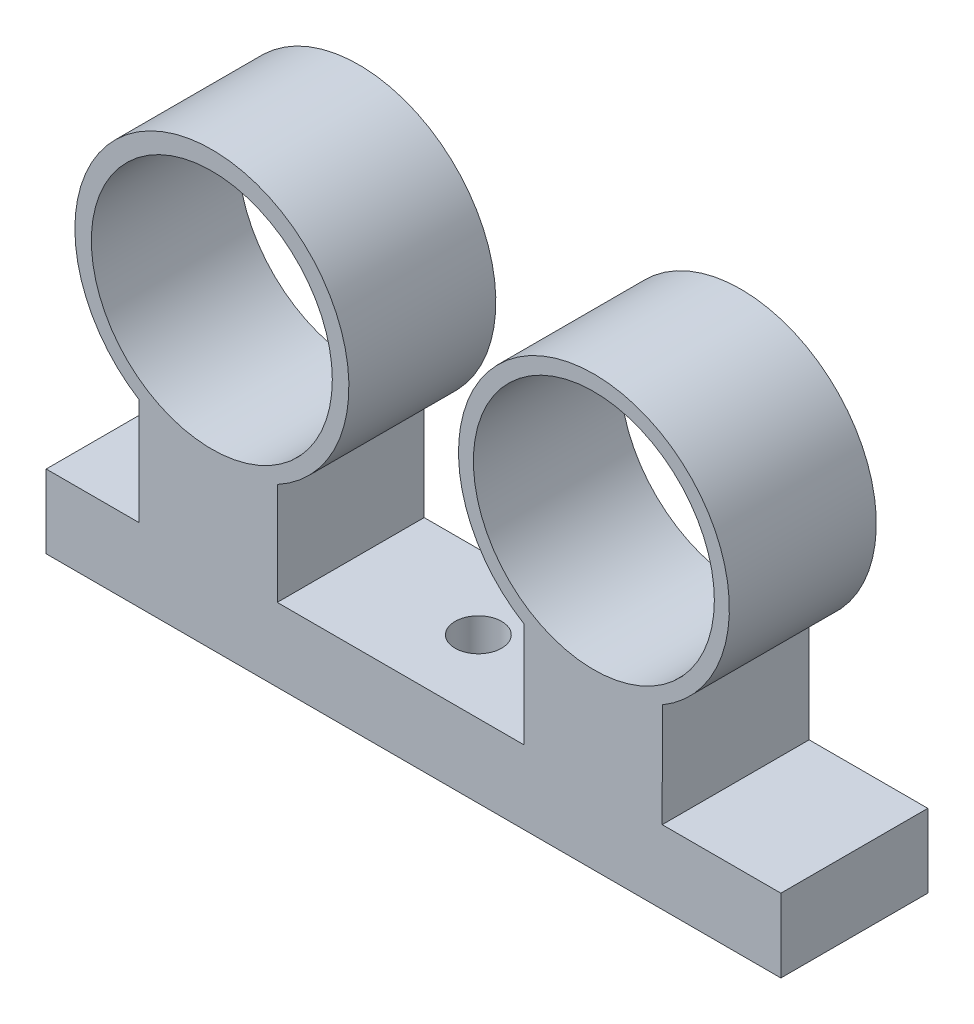
ISO-10303-21;
HEADER;
FILE_DESCRIPTION(('STEP AP214'),'2;1');
FILE_NAME('part.step','',(''),(''),'','','');
FILE_SCHEMA(('AUTOMOTIVE_DESIGN { 1 0 10303 214 1 1 1 1 }'));
ENDSEC;
DATA;
#1=APPLICATION_CONTEXT('core data for automotive mechanical design processes');
#2=APPLICATION_PROTOCOL_DEFINITION('international standard','automotive_design',2000,#1);
#3=PRODUCT_CONTEXT('',#1,'mechanical');
#4=PRODUCT('Part','Part','',(#3));
#5=PRODUCT_RELATED_PRODUCT_CATEGORY('part','',(#4));
#6=PRODUCT_DEFINITION_FORMATION('','',#4);
#7=PRODUCT_DEFINITION_CONTEXT('part definition',#1,'design');
#8=PRODUCT_DEFINITION('design','',#6,#7);
#9=PRODUCT_DEFINITION_SHAPE('','',#8);
#10=(LENGTH_UNIT() NAMED_UNIT(*) SI_UNIT(.MILLI.,.METRE.));
#11=(NAMED_UNIT(*) PLANE_ANGLE_UNIT() SI_UNIT($,.RADIAN.));
#12=(NAMED_UNIT(*) SI_UNIT($,.STERADIAN.) SOLID_ANGLE_UNIT());
#13=UNCERTAINTY_MEASURE_WITH_UNIT(LENGTH_MEASURE(1.E-05),#10,'distance_accuracy_value','');
#14=(GEOMETRIC_REPRESENTATION_CONTEXT(3) GLOBAL_UNCERTAINTY_ASSIGNED_CONTEXT((#13)) GLOBAL_UNIT_ASSIGNED_CONTEXT((#10,
#11,#12)) REPRESENTATION_CONTEXT('',''));
#15=CARTESIAN_POINT('',(0.,0.,0.));
#16=DIRECTION('',(0.,0.,1.));
#17=DIRECTION('',(1.,0.,0.));
#18=AXIS2_PLACEMENT_3D('',#15,#16,#17);
#19=CARTESIAN_POINT('',(0.757716055024708,20.5122052372492,10.));
#20=DIRECTION('',(0.,0.,-1.));
#21=DIRECTION('',(-1.,0.,0.));
#22=AXIS2_PLACEMENT_3D('',#19,#20,#21);
#23=PLANE('',#22);
#24=DIRECTION('',(0.,-1.,0.));
#25=VECTOR('',#24,1.);
#26=CARTESIAN_POINT('',(-10.5194805194805,0.367776118695266,10.));
#27=LINE('',#26,#25);
#28=CARTESIAN_POINT('',(-10.5194805194805,5.36777611869527,10.));
#29=VERTEX_POINT('',#28);
#30=CARTESIAN_POINT('',(-10.5194805194805,0.367776118695266,10.));
#31=VERTEX_POINT('',#30);
#32=EDGE_CURVE('E181',#29,#31,#27,.T.);
#33=ORIENTED_EDGE('',*,*,#32,.T.);
#34=DIRECTION('',(1.,0.,0.));
#35=VECTOR('',#34,1.);
#36=CARTESIAN_POINT('',(-10.5194805194805,0.367776118695266,10.));
#37=LINE('',#36,#35);
#38=CARTESIAN_POINT('',(39.4805194805195,0.367776118695266,10.));
#39=VERTEX_POINT('',#38);
#40=EDGE_CURVE('E109',#31,#39,#37,.T.);
#41=ORIENTED_EDGE('',*,*,#40,.T.);
#42=DIRECTION('',(0.,1.,0.));
#43=VECTOR('',#42,1.);
#44=CARTESIAN_POINT('',(39.4805194805195,0.367776118695266,10.));
#45=LINE('',#44,#43);
#46=CARTESIAN_POINT('',(39.4805194805195,5.36777611869527,10.));
#47=VERTEX_POINT('',#46);
#48=EDGE_CURVE('E208',#39,#47,#45,.T.);
#49=ORIENTED_EDGE('',*,*,#48,.T.);
#50=DIRECTION('',(-1.,0.,0.));
#51=VECTOR('',#50,1.);
#52=CARTESIAN_POINT('',(31.4054543227454,5.36777611869527,10.));
#53=LINE('',#52,#51);
#54=CARTESIAN_POINT('',(31.4054543227454,5.36777611869527,10.));
#55=VERTEX_POINT('',#54);
#56=EDGE_CURVE('E227',#47,#55,#53,.T.);
#57=ORIENTED_EDGE('',*,*,#56,.T.);
#58=DIRECTION('',(0.000767544382990815,0.999999705437767,0.));
#59=VECTOR('',#58,1.);
#60=CARTESIAN_POINT('',(31.4054543227454,5.36777611869527,10.));
#61=LINE('',#60,#59);
#62=CARTESIAN_POINT('',(31.410877884072,12.4338948333994,10.));
#63=VERTEX_POINT('',#62);
#64=EDGE_CURVE('E224',#55,#63,#61,.T.);
#65=ORIENTED_EDGE('',*,*,#64,.T.);
#66=CARTESIAN_POINT('',(26.7579783807905,20.3910097749181,10.));
#67=DIRECTION('',(0.,0.,1.));
#68=DIRECTION('',(-1.,0.,0.));
#69=AXIS2_PLACEMENT_3D('',#66,#67,#68);
#70=CIRCLE('',#69,9.2176543643259);
#71=CARTESIAN_POINT('',(22.0109179543032,12.4897080285313,10.));
#72=VERTEX_POINT('',#71);
#73=EDGE_CURVE('E226',#63,#72,#70,.T.);
#74=ORIENTED_EDGE('',*,*,#73,.T.);
#75=DIRECTION('',(-0.000767544382990732,-0.999999705437767,0.));
#76=VECTOR('',#75,1.);
#77=CARTESIAN_POINT('',(22.0109179543032,12.4897080285313,10.));
#78=LINE('',#77,#76);
#79=CARTESIAN_POINT('',(22.0054515538596,5.36777611869527,10.));
#80=VERTEX_POINT('',#79);
#81=EDGE_CURVE('E229',#72,#80,#78,.T.);
#82=ORIENTED_EDGE('',*,*,#81,.T.);
#83=DIRECTION('',(-1.,0.,0.));
#84=VECTOR('',#83,1.);
#85=CARTESIAN_POINT('',(5.20576559707615,5.36777611869527,10.));
#86=LINE('',#85,#84);
#87=CARTESIAN_POINT('',(5.20576559707615,5.36777611869527,10.));
#88=VERTEX_POINT('',#87);
#89=EDGE_CURVE('E235',#80,#88,#86,.T.);
#90=ORIENTED_EDGE('',*,*,#89,.T.);
#91=DIRECTION('',(0.,1.,0.));
#92=VECTOR('',#91,1.);
#93=CARTESIAN_POINT('',(5.20576559707615,5.36777611869527,10.));
#94=LINE('',#93,#92);
#95=CARTESIAN_POINT('',(5.20576559707615,12.3169950419708,10.));
#96=VERTEX_POINT('',#95);
#97=EDGE_CURVE('E140',#88,#96,#94,.T.);
#98=ORIENTED_EDGE('',*,*,#97,.T.);
#99=CARTESIAN_POINT('',(0.757716055024708,20.5122052372492,10.));
#100=DIRECTION('',(0.,0.,1.));
#101=DIRECTION('',(-1.,0.,0.));
#102=AXIS2_PLACEMENT_3D('',#99,#100,#101);
#103=CIRCLE('',#102,9.32451687077341);
#104=CARTESIAN_POINT('',(-4.1885328598267,12.6076978809575,10.));
#105=VERTEX_POINT('',#104);
#106=EDGE_CURVE('E134',#96,#105,#103,.T.);
#107=ORIENTED_EDGE('',*,*,#106,.T.);
#108=DIRECTION('',(0.,-1.,0.));
#109=VECTOR('',#108,1.);
#110=CARTESIAN_POINT('',(-4.18853285982671,12.6076978809575,10.));
#111=LINE('',#110,#109);
#112=CARTESIAN_POINT('',(-4.18853285982671,5.36777611869527,10.));
#113=VERTEX_POINT('',#112);
#114=EDGE_CURVE('E138',#105,#113,#111,.T.);
#115=ORIENTED_EDGE('',*,*,#114,.T.);
#116=DIRECTION('',(-1.,0.,0.));
#117=VECTOR('',#116,1.);
#118=CARTESIAN_POINT('',(-10.5194805194805,5.36777611869527,10.));
#119=LINE('',#118,#117);
#120=EDGE_CURVE('E54',#113,#29,#119,.T.);
#121=ORIENTED_EDGE('',*,*,#120,.T.);
#122=EDGE_LOOP('',(#33,#41,#49,#57,#65,#74,#82,#90,#98,#107,#115,#121));
#123=FACE_BOUND('',#122,.T.);
#124=CARTESIAN_POINT('',(26.7532467532468,20.3677761186953,10.));
#125=DIRECTION('',(0.,0.,1.));
#126=DIRECTION('',(1.,0.,0.));
#127=AXIS2_PLACEMENT_3D('',#124,#125,#126);
#128=CIRCLE('',#127,8.2);
#129=CARTESIAN_POINT('',(34.9532467532468,20.3677761186953,10.));
#130=VERTEX_POINT('',#129);
#131=EDGE_CURVE('E162',#130,#130,#128,.T.);
#132=ORIENTED_EDGE('',*,*,#131,.F.);
#133=EDGE_LOOP('',(#132));
#134=FACE_BOUND('',#133,.T.);
#135=CARTESIAN_POINT('',(0.753246753246766,20.3677761186953,10.));
#136=DIRECTION('',(0.,0.,1.));
#137=DIRECTION('',(1.,0.,0.));
#138=AXIS2_PLACEMENT_3D('',#135,#136,#137);
#139=CIRCLE('',#138,8.2);
#140=CARTESIAN_POINT('',(8.95324675324677,20.3677761186953,10.));
#141=VERTEX_POINT('',#140);
#142=EDGE_CURVE('E288',#141,#141,#139,.T.);
#143=ORIENTED_EDGE('',*,*,#142,.F.);
#144=EDGE_LOOP('',(#143));
#145=FACE_BOUND('',#144,.T.);
#146=ADVANCED_FACE('F37',(#123,#134,#145),#23,.F.);
#147=CARTESIAN_POINT('',(0.757716055024708,20.5122052372492,0.));
#148=DIRECTION('',(0.,0.,-1.));
#149=DIRECTION('',(-1.,0.,0.));
#150=AXIS2_PLACEMENT_3D('',#147,#148,#149);
#151=PLANE('',#150);
#152=CARTESIAN_POINT('',(26.7532467532468,20.3677761186953,0.));
#153=DIRECTION('',(0.,0.,1.));
#154=DIRECTION('',(1.,0.,0.));
#155=AXIS2_PLACEMENT_3D('',#152,#153,#154);
#156=CIRCLE('',#155,8.2);
#157=CARTESIAN_POINT('',(34.9532467532468,20.3677761186953,0.));
#158=VERTEX_POINT('',#157);
#159=EDGE_CURVE('E293',#158,#158,#156,.T.);
#160=ORIENTED_EDGE('',*,*,#159,.T.);
#161=EDGE_LOOP('',(#160));
#162=FACE_BOUND('',#161,.T.);
#163=DIRECTION('',(0.,-1.,0.));
#164=VECTOR('',#163,1.);
#165=CARTESIAN_POINT('',(-10.5194805194805,0.367776118695266,0.));
#166=LINE('',#165,#164);
#167=CARTESIAN_POINT('',(-10.5194805194805,5.36777611869527,0.));
#168=VERTEX_POINT('',#167);
#169=CARTESIAN_POINT('',(-10.5194805194805,0.367776118695266,0.));
#170=VERTEX_POINT('',#169);
#171=EDGE_CURVE('E158',#168,#170,#166,.T.);
#172=ORIENTED_EDGE('',*,*,#171,.F.);
#173=DIRECTION('',(-1.,0.,0.));
#174=VECTOR('',#173,1.);
#175=CARTESIAN_POINT('',(-10.5194805194805,5.36777611869527,0.));
#176=LINE('',#175,#174);
#177=CARTESIAN_POINT('',(-4.18853285982671,5.36777611869527,0.));
#178=VERTEX_POINT('',#177);
#179=EDGE_CURVE('E101',#178,#168,#176,.T.);
#180=ORIENTED_EDGE('',*,*,#179,.F.);
#181=DIRECTION('',(0.,-1.,0.));
#182=VECTOR('',#181,1.);
#183=CARTESIAN_POINT('',(-4.18853285982671,12.6076978809575,0.));
#184=LINE('',#183,#182);
#185=CARTESIAN_POINT('',(-4.1885328598267,12.6076978809575,0.));
#186=VERTEX_POINT('',#185);
#187=EDGE_CURVE('E95',#186,#178,#184,.T.);
#188=ORIENTED_EDGE('',*,*,#187,.F.);
#189=CARTESIAN_POINT('',(0.757716055024708,20.5122052372492,0.));
#190=DIRECTION('',(0.,0.,1.));
#191=DIRECTION('',(-1.,0.,0.));
#192=AXIS2_PLACEMENT_3D('',#189,#190,#191);
#193=CIRCLE('',#192,9.32451687077341);
#194=CARTESIAN_POINT('',(5.20576559707615,12.3169950419708,0.));
#195=VERTEX_POINT('',#194);
#196=EDGE_CURVE('E148',#195,#186,#193,.T.);
#197=ORIENTED_EDGE('',*,*,#196,.F.);
#198=DIRECTION('',(0.,1.,0.));
#199=VECTOR('',#198,1.);
#200=CARTESIAN_POINT('',(5.20576559707615,5.36777611869527,0.));
#201=LINE('',#200,#199);
#202=CARTESIAN_POINT('',(5.20576559707615,5.36777611869527,0.));
#203=VERTEX_POINT('',#202);
#204=EDGE_CURVE('E176',#203,#195,#201,.T.);
#205=ORIENTED_EDGE('',*,*,#204,.F.);
#206=DIRECTION('',(-1.,0.,0.));
#207=VECTOR('',#206,1.);
#208=CARTESIAN_POINT('',(5.20576559707615,5.36777611869527,0.));
#209=LINE('',#208,#207);
#210=CARTESIAN_POINT('',(22.0054515538596,5.36777611869527,0.));
#211=VERTEX_POINT('',#210);
#212=EDGE_CURVE('E174',#211,#203,#209,.T.);
#213=ORIENTED_EDGE('',*,*,#212,.F.);
#214=DIRECTION('',(-0.000767544382990732,-0.999999705437767,0.));
#215=VECTOR('',#214,1.);
#216=CARTESIAN_POINT('',(22.0109179543032,12.4897080285313,0.));
#217=LINE('',#216,#215);
#218=CARTESIAN_POINT('',(22.0109179543032,12.4897080285313,0.));
#219=VERTEX_POINT('',#218);
#220=EDGE_CURVE('E172',#219,#211,#217,.T.);
#221=ORIENTED_EDGE('',*,*,#220,.F.);
#222=CARTESIAN_POINT('',(26.7579783807905,20.3910097749181,0.));
#223=DIRECTION('',(0.,0.,1.));
#224=DIRECTION('',(-1.,0.,0.));
#225=AXIS2_PLACEMENT_3D('',#222,#223,#224);
#226=CIRCLE('',#225,9.2176543643259);
#227=CARTESIAN_POINT('',(31.410877884072,12.4338948333994,0.));
#228=VERTEX_POINT('',#227);
#229=EDGE_CURVE('E170',#228,#219,#226,.T.);
#230=ORIENTED_EDGE('',*,*,#229,.F.);
#231=DIRECTION('',(0.000767544382990815,0.999999705437767,0.));
#232=VECTOR('',#231,1.);
#233=CARTESIAN_POINT('',(31.4054543227454,5.36777611869527,0.));
#234=LINE('',#233,#232);
#235=CARTESIAN_POINT('',(31.4054543227454,5.36777611869527,0.));
#236=VERTEX_POINT('',#235);
#237=EDGE_CURVE('E168',#236,#228,#234,.T.);
#238=ORIENTED_EDGE('',*,*,#237,.F.);
#239=DIRECTION('',(-1.,0.,0.));
#240=VECTOR('',#239,1.);
#241=CARTESIAN_POINT('',(31.4054543227454,5.36777611869527,0.));
#242=LINE('',#241,#240);
#243=CARTESIAN_POINT('',(39.4805194805195,5.36777611869527,0.));
#244=VERTEX_POINT('',#243);
#245=EDGE_CURVE('E166',#244,#236,#242,.T.);
#246=ORIENTED_EDGE('',*,*,#245,.F.);
#247=DIRECTION('',(0.,1.,0.));
#248=VECTOR('',#247,1.);
#249=CARTESIAN_POINT('',(39.4805194805195,0.367776118695266,0.));
#250=LINE('',#249,#248);
#251=CARTESIAN_POINT('',(39.4805194805195,0.367776118695266,0.));
#252=VERTEX_POINT('',#251);
#253=EDGE_CURVE('E164',#252,#244,#250,.T.);
#254=ORIENTED_EDGE('',*,*,#253,.F.);
#255=DIRECTION('',(1.,0.,0.));
#256=VECTOR('',#255,1.);
#257=CARTESIAN_POINT('',(-10.5194805194805,0.367776118695266,0.));
#258=LINE('',#257,#256);
#259=EDGE_CURVE('E161',#170,#252,#258,.T.);
#260=ORIENTED_EDGE('',*,*,#259,.F.);
#261=EDGE_LOOP('',(#172,#180,#188,#197,#205,#213,#221,#230,#238,#246,#254,#260));
#262=FACE_BOUND('',#261,.T.);
#263=CARTESIAN_POINT('',(0.753246753246766,20.3677761186953,0.));
#264=DIRECTION('',(0.,0.,1.));
#265=DIRECTION('',(1.,0.,0.));
#266=AXIS2_PLACEMENT_3D('',#263,#264,#265);
#267=CIRCLE('',#266,8.2);
#268=CARTESIAN_POINT('',(8.95324675324677,20.3677761186953,0.));
#269=VERTEX_POINT('',#268);
#270=EDGE_CURVE('E285',#269,#269,#267,.T.);
#271=ORIENTED_EDGE('',*,*,#270,.T.);
#272=EDGE_LOOP('',(#271));
#273=FACE_BOUND('',#272,.T.);
#274=ADVANCED_FACE('F212',(#162,#262,#273),#151,.T.);
#275=CARTESIAN_POINT('',(-10.5194805194805,0.367776118695266,10.));
#276=DIRECTION('',(1.,0.,0.));
#277=DIRECTION('',(0.,0.,-1.));
#278=AXIS2_PLACEMENT_3D('',#275,#276,#277);
#279=PLANE('',#278);
#280=ORIENTED_EDGE('',*,*,#171,.T.);
#281=DIRECTION('',(0.,0.,-1.));
#282=VECTOR('',#281,1.);
#283=CARTESIAN_POINT('',(-10.5194805194805,0.367776118695266,10.));
#284=LINE('',#283,#282);
#285=EDGE_CURVE('E11',#31,#170,#284,.T.);
#286=ORIENTED_EDGE('',*,*,#285,.F.);
#287=ORIENTED_EDGE('',*,*,#32,.F.);
#288=DIRECTION('',(0.,0.,-1.));
#289=VECTOR('',#288,1.);
#290=CARTESIAN_POINT('',(-10.5194805194805,5.36777611869527,10.));
#291=LINE('',#290,#289);
#292=EDGE_CURVE('E154',#29,#168,#291,.T.);
#293=ORIENTED_EDGE('',*,*,#292,.T.);
#294=EDGE_LOOP('',(#280,#286,#287,#293));
#295=FACE_BOUND('',#294,.T.);
#296=ADVANCED_FACE('F39',(#295),#279,.F.);
#297=CARTESIAN_POINT('',(-10.5194805194805,0.367776118695266,10.));
#298=DIRECTION('',(0.,1.,0.));
#299=DIRECTION('',(0.,0.,1.));
#300=AXIS2_PLACEMENT_3D('',#297,#298,#299);
#301=PLANE('',#300);
#302=CARTESIAN_POINT('',(13.9586260209277,0.367776118695266,5.06711195164022));
#303=DIRECTION('',(0.,1.,0.));
#304=DIRECTION('',(0.,0.,1.));
#305=AXIS2_PLACEMENT_3D('',#302,#303,#304);
#306=CIRCLE('',#305,1.585);
#307=CARTESIAN_POINT('',(13.9586260209277,0.367776118695266,6.65211195164022));
#308=VERTEX_POINT('',#307);
#309=EDGE_CURVE('E283',#308,#308,#306,.T.);
#310=ORIENTED_EDGE('',*,*,#309,.T.);
#311=EDGE_LOOP('',(#310));
#312=FACE_BOUND('',#311,.T.);
#313=ORIENTED_EDGE('',*,*,#259,.T.);
#314=DIRECTION('',(0.,0.,-1.));
#315=VECTOR('',#314,1.);
#316=CARTESIAN_POINT('',(39.4805194805195,0.367776118695266,10.));
#317=LINE('',#316,#315);
#318=EDGE_CURVE('E46',#39,#252,#317,.T.);
#319=ORIENTED_EDGE('',*,*,#318,.F.);
#320=ORIENTED_EDGE('',*,*,#40,.F.);
#321=ORIENTED_EDGE('',*,*,#285,.T.);
#322=EDGE_LOOP('',(#313,#319,#320,#321));
#323=FACE_BOUND('',#322,.T.);
#324=ADVANCED_FACE('F307',(#312,#323),#301,.F.);
#325=CARTESIAN_POINT('',(39.4805194805195,0.367776118695266,10.));
#326=DIRECTION('',(-1.,0.,0.));
#327=DIRECTION('',(0.,0.,1.));
#328=AXIS2_PLACEMENT_3D('',#325,#326,#327);
#329=PLANE('',#328);
#330=ORIENTED_EDGE('',*,*,#253,.T.);
#331=DIRECTION('',(0.,0.,-1.));
#332=VECTOR('',#331,1.);
#333=CARTESIAN_POINT('',(39.4805194805195,5.36777611869527,10.));
#334=LINE('',#333,#332);
#335=EDGE_CURVE('E200',#47,#244,#334,.T.);
#336=ORIENTED_EDGE('',*,*,#335,.F.);
#337=ORIENTED_EDGE('',*,*,#48,.F.);
#338=ORIENTED_EDGE('',*,*,#318,.T.);
#339=EDGE_LOOP('',(#330,#336,#337,#338));
#340=FACE_BOUND('',#339,.T.);
#341=ADVANCED_FACE('F206',(#340),#329,.F.);
#342=CARTESIAN_POINT('',(31.4054543227454,5.36777611869527,10.));
#343=DIRECTION('',(0.,-1.,0.));
#344=DIRECTION('',(0.,0.,-1.));
#345=AXIS2_PLACEMENT_3D('',#342,#343,#344);
#346=PLANE('',#345);
#347=ORIENTED_EDGE('',*,*,#245,.T.);
#348=DIRECTION('',(0.,0.,-1.));
#349=VECTOR('',#348,1.);
#350=CARTESIAN_POINT('',(31.4054543227454,5.36777611869527,10.));
#351=LINE('',#350,#349);
#352=EDGE_CURVE('E197',#55,#236,#351,.T.);
#353=ORIENTED_EDGE('',*,*,#352,.F.);
#354=ORIENTED_EDGE('',*,*,#56,.F.);
#355=ORIENTED_EDGE('',*,*,#335,.T.);
#356=EDGE_LOOP('',(#347,#353,#354,#355));
#357=FACE_BOUND('',#356,.T.);
#358=ADVANCED_FACE('F218',(#357),#346,.F.);
#359=CARTESIAN_POINT('',(31.4054543227454,5.36777611869527,10.));
#360=DIRECTION('',(-0.999999705437767,0.000767544382990815,0.));
#361=DIRECTION('',(-0.000767544382990815,-0.999999705437767,0.));
#362=AXIS2_PLACEMENT_3D('',#359,#360,#361);
#363=PLANE('',#362);
#364=ORIENTED_EDGE('',*,*,#237,.T.);
#365=DIRECTION('',(0.,0.,-1.));
#366=VECTOR('',#365,1.);
#367=CARTESIAN_POINT('',(31.410877884072,12.4338948333994,10.));
#368=LINE('',#367,#366);
#369=EDGE_CURVE('E194',#63,#228,#368,.T.);
#370=ORIENTED_EDGE('',*,*,#369,.F.);
#371=ORIENTED_EDGE('',*,*,#64,.F.);
#372=ORIENTED_EDGE('',*,*,#352,.T.);
#373=EDGE_LOOP('',(#364,#370,#371,#372));
#374=FACE_BOUND('',#373,.T.);
#375=ADVANCED_FACE('F222',(#374),#363,.F.);
#376=CARTESIAN_POINT('',(26.7579783807905,20.3910097749181,10.));
#377=DIRECTION('',(0.,0.,-1.));
#378=DIRECTION('',(-1.,0.,0.));
#379=AXIS2_PLACEMENT_3D('',#376,#377,#378);
#380=CYLINDRICAL_SURFACE('',#379,9.2176543643259);
#381=ORIENTED_EDGE('',*,*,#229,.T.);
#382=DIRECTION('',(0.,0.,-1.));
#383=VECTOR('',#382,1.);
#384=CARTESIAN_POINT('',(22.0109179543032,12.4897080285313,10.));
#385=LINE('',#384,#383);
#386=EDGE_CURVE('E191',#72,#219,#385,.T.);
#387=ORIENTED_EDGE('',*,*,#386,.F.);
#388=ORIENTED_EDGE('',*,*,#73,.F.);
#389=ORIENTED_EDGE('',*,*,#369,.T.);
#390=EDGE_LOOP('',(#381,#387,#388,#389));
#391=FACE_BOUND('',#390,.T.);
#392=ADVANCED_FACE('F319',(#391),#380,.T.);
#393=CARTESIAN_POINT('',(22.0109179543032,12.4897080285313,10.));
#394=DIRECTION('',(0.999999705437767,-0.000767544382990732,0.));
#395=DIRECTION('',(0.000767544382990732,0.999999705437767,0.));
#396=AXIS2_PLACEMENT_3D('',#393,#394,#395);
#397=PLANE('',#396);
#398=ORIENTED_EDGE('',*,*,#220,.T.);
#399=DIRECTION('',(0.,0.,-1.));
#400=VECTOR('',#399,1.);
#401=CARTESIAN_POINT('',(22.0054515538596,5.36777611869527,10.));
#402=LINE('',#401,#400);
#403=EDGE_CURVE('E188',#80,#211,#402,.T.);
#404=ORIENTED_EDGE('',*,*,#403,.F.);
#405=ORIENTED_EDGE('',*,*,#81,.F.);
#406=ORIENTED_EDGE('',*,*,#386,.T.);
#407=EDGE_LOOP('',(#398,#404,#405,#406));
#408=FACE_BOUND('',#407,.T.);
#409=ADVANCED_FACE('F322',(#408),#397,.F.);
#410=CARTESIAN_POINT('',(5.20576559707615,5.36777611869527,10.));
#411=DIRECTION('',(0.,-1.,0.));
#412=DIRECTION('',(0.,0.,-1.));
#413=AXIS2_PLACEMENT_3D('',#410,#411,#412);
#414=PLANE('',#413);
#415=CARTESIAN_POINT('',(13.9586260209277,5.36777611869527,5.06711195164022));
#416=DIRECTION('',(0.,1.,0.));
#417=DIRECTION('',(0.,0.,1.));
#418=AXIS2_PLACEMENT_3D('',#415,#416,#417);
#419=CIRCLE('',#418,1.585);
#420=CARTESIAN_POINT('',(13.9586260209277,5.36777611869527,6.65211195164022));
#421=VERTEX_POINT('',#420);
#422=EDGE_CURVE('E280',#421,#421,#419,.T.);
#423=ORIENTED_EDGE('',*,*,#422,.F.);
#424=EDGE_LOOP('',(#423));
#425=FACE_BOUND('',#424,.T.);
#426=ORIENTED_EDGE('',*,*,#212,.T.);
#427=DIRECTION('',(0.,0.,-1.));
#428=VECTOR('',#427,1.);
#429=CARTESIAN_POINT('',(5.20576559707615,5.36777611869527,10.));
#430=LINE('',#429,#428);
#431=EDGE_CURVE('E185',#88,#203,#430,.T.);
#432=ORIENTED_EDGE('',*,*,#431,.F.);
#433=ORIENTED_EDGE('',*,*,#89,.F.);
#434=ORIENTED_EDGE('',*,*,#403,.T.);
#435=EDGE_LOOP('',(#426,#432,#433,#434));
#436=FACE_BOUND('',#435,.T.);
#437=ADVANCED_FACE('F241',(#425,#436),#414,.F.);
#438=CARTESIAN_POINT('',(5.20576559707615,5.36777611869527,10.));
#439=DIRECTION('',(-1.,0.,0.));
#440=DIRECTION('',(0.,0.,1.));
#441=AXIS2_PLACEMENT_3D('',#438,#439,#440);
#442=PLANE('',#441);
#443=ORIENTED_EDGE('',*,*,#204,.T.);
#444=DIRECTION('',(0.,0.,-1.));
#445=VECTOR('',#444,1.);
#446=CARTESIAN_POINT('',(5.20576559707615,12.3169950419708,10.));
#447=LINE('',#446,#445);
#448=EDGE_CURVE('E149',#96,#195,#447,.T.);
#449=ORIENTED_EDGE('',*,*,#448,.F.);
#450=ORIENTED_EDGE('',*,*,#97,.F.);
#451=ORIENTED_EDGE('',*,*,#431,.T.);
#452=EDGE_LOOP('',(#443,#449,#450,#451));
#453=FACE_BOUND('',#452,.T.);
#454=ADVANCED_FACE('F245',(#453),#442,.F.);
#455=CARTESIAN_POINT('',(0.757716055024708,20.5122052372492,10.));
#456=DIRECTION('',(0.,0.,-1.));
#457=DIRECTION('',(-1.,0.,0.));
#458=AXIS2_PLACEMENT_3D('',#455,#456,#457);
#459=CYLINDRICAL_SURFACE('',#458,9.32451687077341);
#460=ORIENTED_EDGE('',*,*,#196,.T.);
#461=DIRECTION('',(0.,0.,-1.));
#462=VECTOR('',#461,1.);
#463=CARTESIAN_POINT('',(-4.1885328598267,12.6076978809575,10.));
#464=LINE('',#463,#462);
#465=EDGE_CURVE('E145',#105,#186,#464,.T.);
#466=ORIENTED_EDGE('',*,*,#465,.F.);
#467=ORIENTED_EDGE('',*,*,#106,.F.);
#468=ORIENTED_EDGE('',*,*,#448,.T.);
#469=EDGE_LOOP('',(#460,#466,#467,#468));
#470=FACE_BOUND('',#469,.T.);
#471=ADVANCED_FACE('F146',(#470),#459,.T.);
#472=CARTESIAN_POINT('',(-4.18853285982671,12.6076978809575,10.));
#473=DIRECTION('',(1.,0.,0.));
#474=DIRECTION('',(0.,0.,-1.));
#475=AXIS2_PLACEMENT_3D('',#472,#473,#474);
#476=PLANE('',#475);
#477=ORIENTED_EDGE('',*,*,#187,.T.);
#478=DIRECTION('',(0.,0.,-1.));
#479=VECTOR('',#478,1.);
#480=CARTESIAN_POINT('',(-4.18853285982671,5.36777611869527,10.));
#481=LINE('',#480,#479);
#482=EDGE_CURVE('E150',#113,#178,#481,.T.);
#483=ORIENTED_EDGE('',*,*,#482,.F.);
#484=ORIENTED_EDGE('',*,*,#114,.F.);
#485=ORIENTED_EDGE('',*,*,#465,.T.);
#486=EDGE_LOOP('',(#477,#483,#484,#485));
#487=FACE_BOUND('',#486,.T.);
#488=ADVANCED_FACE('F152',(#487),#476,.F.);
#489=CARTESIAN_POINT('',(-10.5194805194805,5.36777611869527,10.));
#490=DIRECTION('',(0.,-1.,0.));
#491=DIRECTION('',(0.,0.,-1.));
#492=AXIS2_PLACEMENT_3D('',#489,#490,#491);
#493=PLANE('',#492);
#494=ORIENTED_EDGE('',*,*,#179,.T.);
#495=ORIENTED_EDGE('',*,*,#292,.F.);
#496=ORIENTED_EDGE('',*,*,#120,.F.);
#497=ORIENTED_EDGE('',*,*,#482,.T.);
#498=EDGE_LOOP('',(#494,#495,#496,#497));
#499=FACE_BOUND('',#498,.T.);
#500=ADVANCED_FACE('F249',(#499),#493,.F.);
#501=CARTESIAN_POINT('',(26.7532467532468,20.3677761186953,10.));
#502=DIRECTION('',(0.,0.,-1.));
#503=DIRECTION('',(-1.,0.,0.));
#504=AXIS2_PLACEMENT_3D('',#501,#502,#503);
#505=CYLINDRICAL_SURFACE('',#504,8.2);
#506=ORIENTED_EDGE('',*,*,#131,.T.);
#507=EDGE_LOOP('',(#506));
#508=FACE_BOUND('',#507,.T.);
#509=ORIENTED_EDGE('',*,*,#159,.F.);
#510=EDGE_LOOP('',(#509));
#511=FACE_BOUND('',#510,.T.);
#512=ADVANCED_FACE('F251',(#508,#511),#505,.F.);
#513=CARTESIAN_POINT('',(0.753246753246766,20.3677761186953,10.));
#514=DIRECTION('',(0.,0.,-1.));
#515=DIRECTION('',(-1.,0.,0.));
#516=AXIS2_PLACEMENT_3D('',#513,#514,#515);
#517=CYLINDRICAL_SURFACE('',#516,8.2);
#518=ORIENTED_EDGE('',*,*,#142,.T.);
#519=EDGE_LOOP('',(#518));
#520=FACE_BOUND('',#519,.T.);
#521=ORIENTED_EDGE('',*,*,#270,.F.);
#522=EDGE_LOOP('',(#521));
#523=FACE_BOUND('',#522,.T.);
#524=ADVANCED_FACE('F257',(#520,#523),#517,.F.);
#525=CARTESIAN_POINT('',(13.9586260209277,-4.63222388130473,5.06711195164022));
#526=DIRECTION('',(0.,1.,0.));
#527=DIRECTION('',(0.,0.,1.));
#528=AXIS2_PLACEMENT_3D('',#525,#526,#527);
#529=CYLINDRICAL_SURFACE('',#528,1.585);
#530=ORIENTED_EDGE('',*,*,#422,.T.);
#531=EDGE_LOOP('',(#530));
#532=FACE_BOUND('',#531,.T.);
#533=ORIENTED_EDGE('',*,*,#309,.F.);
#534=EDGE_LOOP('',(#533));
#535=FACE_BOUND('',#534,.T.);
#536=ADVANCED_FACE('F271',(#532,#535),#529,.F.);
#537=CLOSED_SHELL('',(#146,#274,#296,#324,#341,#358,#375,#392,#409,#437,#454,#471,#488,#500,
#512,#524,#536));
#538=MANIFOLD_SOLID_BREP('B2',#537);
#539=ADVANCED_BREP_SHAPE_REPRESENTATION('',(#18,#538),#14);
#540=SHAPE_DEFINITION_REPRESENTATION(#9,#539);
ENDSEC;
END-ISO-10303-21;
